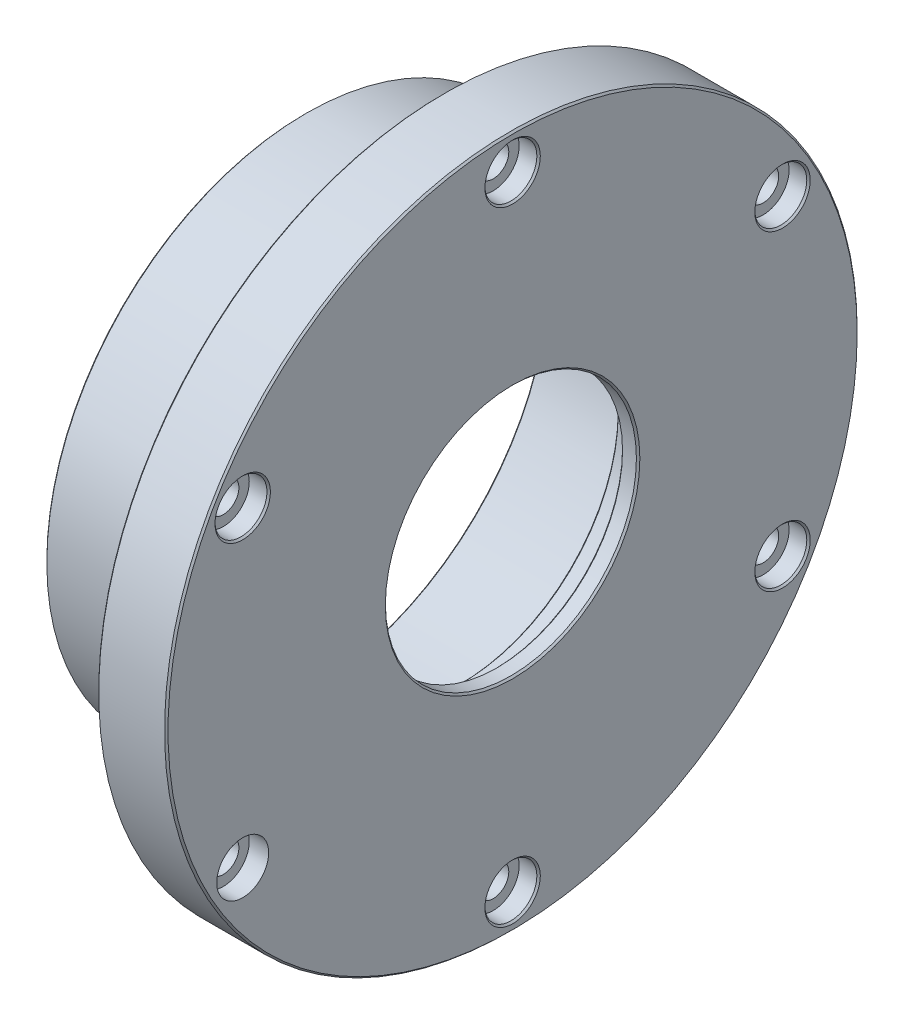
ISO-10303-21;
HEADER;
FILE_DESCRIPTION(('STEP AP214'),'2;1');
FILE_NAME('part.step','',(''),(''),'','','');
FILE_SCHEMA(('AUTOMOTIVE_DESIGN { 1 0 10303 214 1 1 1 1 }'));
ENDSEC;
DATA;
#1=APPLICATION_CONTEXT('core data for automotive mechanical design processes');
#2=APPLICATION_PROTOCOL_DEFINITION('international standard','automotive_design',2000,#1);
#3=PRODUCT_CONTEXT('',#1,'mechanical');
#4=PRODUCT('Part','Part','',(#3));
#5=PRODUCT_RELATED_PRODUCT_CATEGORY('part','',(#4));
#6=PRODUCT_DEFINITION_FORMATION('','',#4);
#7=PRODUCT_DEFINITION_CONTEXT('part definition',#1,'design');
#8=PRODUCT_DEFINITION('design','',#6,#7);
#9=PRODUCT_DEFINITION_SHAPE('','',#8);
#10=(LENGTH_UNIT() NAMED_UNIT(*) SI_UNIT(.MILLI.,.METRE.));
#11=(NAMED_UNIT(*) PLANE_ANGLE_UNIT() SI_UNIT($,.RADIAN.));
#12=(NAMED_UNIT(*) SI_UNIT($,.STERADIAN.) SOLID_ANGLE_UNIT());
#13=UNCERTAINTY_MEASURE_WITH_UNIT(LENGTH_MEASURE(1.E-05),#10,'distance_accuracy_value','');
#14=(GEOMETRIC_REPRESENTATION_CONTEXT(3) GLOBAL_UNCERTAINTY_ASSIGNED_CONTEXT((#13)) GLOBAL_UNIT_ASSIGNED_CONTEXT((#10,
#11,#12)) REPRESENTATION_CONTEXT('',''));
#15=CARTESIAN_POINT('',(0.,0.,0.));
#16=DIRECTION('',(0.,0.,1.));
#17=DIRECTION('',(1.,0.,0.));
#18=AXIS2_PLACEMENT_3D('',#15,#16,#17);
#19=CARTESIAN_POINT('',(22.9387484712198,0.,0.));
#20=DIRECTION('',(1.,0.,0.));
#21=DIRECTION('',(0.,0.,-1.));
#22=AXIS2_PLACEMENT_3D('',#19,#20,#21);
#23=PLANE('',#22);
#24=CARTESIAN_POINT('',(22.9387484712198,-33.1832367172753,0.));
#25=DIRECTION('',(1.,0.,0.));
#26=DIRECTION('',(0.,0.,-1.));
#27=AXIS2_PLACEMENT_3D('',#24,#25,#26);
#28=CIRCLE('',#27,99.5000000000001);
#29=CARTESIAN_POINT('',(22.9387484712198,-33.1832367172753,-99.5000000000001));
#30=VERTEX_POINT('',#29);
#31=EDGE_CURVE('E152',#30,#30,#28,.F.);
#32=ORIENTED_EDGE('',*,*,#31,.T.);
#33=EDGE_LOOP('',(#32));
#34=FACE_BOUND('',#33,.T.);
#35=CARTESIAN_POINT('',(22.9387484712198,-123.183236717275,0.));
#36=DIRECTION('',(1.,0.,0.));
#37=DIRECTION('',(0.,0.,-1.));
#38=AXIS2_PLACEMENT_3D('',#35,#36,#37);
#39=CIRCLE('',#38,5.);
#40=CARTESIAN_POINT('',(22.9387484712198,-123.183236717275,-5.00000000000002));
#41=VERTEX_POINT('',#40);
#42=EDGE_CURVE('E156',#41,#41,#39,.T.);
#43=ORIENTED_EDGE('',*,*,#42,.T.);
#44=EDGE_LOOP('',(#43));
#45=FACE_BOUND('',#44,.T.);
#46=CARTESIAN_POINT('',(22.9387484712198,-78.1832367172752,-77.9422863405995));
#47=DIRECTION('',(1.,0.,0.));
#48=DIRECTION('',(0.,0.,-1.));
#49=AXIS2_PLACEMENT_3D('',#46,#47,#48);
#50=CIRCLE('',#49,5.);
#51=CARTESIAN_POINT('',(22.9387484712198,-78.1832367172752,-82.9422863405995));
#52=VERTEX_POINT('',#51);
#53=EDGE_CURVE('E160',#52,#52,#50,.T.);
#54=ORIENTED_EDGE('',*,*,#53,.T.);
#55=EDGE_LOOP('',(#54));
#56=FACE_BOUND('',#55,.T.);
#57=CARTESIAN_POINT('',(22.9387484712198,11.8167632827247,-77.9422863405995));
#58=DIRECTION('',(1.,0.,0.));
#59=DIRECTION('',(0.,0.,-1.));
#60=AXIS2_PLACEMENT_3D('',#57,#58,#59);
#61=CIRCLE('',#60,5.);
#62=CARTESIAN_POINT('',(22.9387484712198,11.8167632827247,-82.9422863405995));
#63=VERTEX_POINT('',#62);
#64=EDGE_CURVE('E164',#63,#63,#61,.T.);
#65=ORIENTED_EDGE('',*,*,#64,.T.);
#66=EDGE_LOOP('',(#65));
#67=FACE_BOUND('',#66,.T.);
#68=CARTESIAN_POINT('',(22.9387484712198,56.8167632827247,0.));
#69=DIRECTION('',(1.,0.,0.));
#70=DIRECTION('',(0.,0.,-1.));
#71=AXIS2_PLACEMENT_3D('',#68,#69,#70);
#72=CIRCLE('',#71,5.);
#73=CARTESIAN_POINT('',(22.9387484712198,56.8167632827247,-5.));
#74=VERTEX_POINT('',#73);
#75=EDGE_CURVE('E168',#74,#74,#72,.T.);
#76=ORIENTED_EDGE('',*,*,#75,.T.);
#77=EDGE_LOOP('',(#76));
#78=FACE_BOUND('',#77,.T.);
#79=CARTESIAN_POINT('',(22.9387484712198,11.8167632827247,77.9422863405995));
#80=DIRECTION('',(1.,0.,0.));
#81=DIRECTION('',(0.,0.,-1.));
#82=AXIS2_PLACEMENT_3D('',#79,#80,#81);
#83=CIRCLE('',#82,5.);
#84=CARTESIAN_POINT('',(22.9387484712198,11.8167632827247,72.9422863405995));
#85=VERTEX_POINT('',#84);
#86=EDGE_CURVE('E172',#85,#85,#83,.T.);
#87=ORIENTED_EDGE('',*,*,#86,.T.);
#88=EDGE_LOOP('',(#87));
#89=FACE_BOUND('',#88,.T.);
#90=CARTESIAN_POINT('',(22.9387484712198,-78.1832367172753,77.9422863405995));
#91=DIRECTION('',(1.,0.,0.));
#92=DIRECTION('',(0.,0.,-1.));
#93=AXIS2_PLACEMENT_3D('',#90,#91,#92);
#94=CIRCLE('',#93,5.);
#95=CARTESIAN_POINT('',(22.9387484712198,-78.1832367172753,72.9422863405995));
#96=VERTEX_POINT('',#95);
#97=EDGE_CURVE('E176',#96,#96,#94,.T.);
#98=ORIENTED_EDGE('',*,*,#97,.T.);
#99=EDGE_LOOP('',(#98));
#100=FACE_BOUND('',#99,.T.);
#101=CARTESIAN_POINT('',(22.9387484712198,-33.1832367172753,0.));
#102=DIRECTION('',(-1.,0.,0.));
#103=DIRECTION('',(0.,0.,1.));
#104=AXIS2_PLACEMENT_3D('',#101,#102,#103);
#105=CIRCLE('',#104,75.);
#106=CARTESIAN_POINT('',(22.9387484712198,-33.1832367172753,75.));
#107=VERTEX_POINT('',#106);
#108=EDGE_CURVE('E216',#107,#107,#105,.T.);
#109=ORIENTED_EDGE('',*,*,#108,.F.);
#110=EDGE_LOOP('',(#109));
#111=FACE_BOUND('',#110,.T.);
#112=ADVANCED_FACE('F47',(#34,#45,#56,#67,#78,#89,#100,#111),#23,.F.);
#113=CARTESIAN_POINT('',(-15.2619045358166,-33.1832367172753,0.));
#114=DIRECTION('',(-1.,0.,0.));
#115=DIRECTION('',(0.,0.,1.));
#116=AXIS2_PLACEMENT_3D('',#113,#114,#115);
#117=CYLINDRICAL_SURFACE('',#116,60.);
#118=CARTESIAN_POINT('',(22.4387484712199,-33.1832367172753,0.));
#119=DIRECTION('',(-1.,0.,0.));
#120=DIRECTION('',(0.,0.,1.));
#121=AXIS2_PLACEMENT_3D('',#118,#119,#120);
#122=CIRCLE('',#121,60.);
#123=CARTESIAN_POINT('',(22.4387484712199,-33.1832367172753,60.));
#124=VERTEX_POINT('',#123);
#125=EDGE_CURVE('E196',#124,#124,#122,.T.);
#126=ORIENTED_EDGE('',*,*,#125,.T.);
#127=EDGE_LOOP('',(#126));
#128=FACE_BOUND('',#127,.T.);
#129=CARTESIAN_POINT('',(27.9387484712198,-33.1832367172753,0.));
#130=DIRECTION('',(-1.,0.,0.));
#131=DIRECTION('',(0.,0.,1.));
#132=AXIS2_PLACEMENT_3D('',#129,#130,#131);
#133=CIRCLE('',#132,60.);
#134=CARTESIAN_POINT('',(27.9387484712198,-33.1832367172753,60.));
#135=VERTEX_POINT('',#134);
#136=EDGE_CURVE('E208',#135,#135,#133,.T.);
#137=ORIENTED_EDGE('',*,*,#136,.F.);
#138=EDGE_LOOP('',(#137));
#139=FACE_BOUND('',#138,.T.);
#140=ADVANCED_FACE('F296',(#128,#139),#117,.F.);
#141=CARTESIAN_POINT('',(27.9387484712198,0.,0.));
#142=DIRECTION('',(1.,0.,0.));
#143=DIRECTION('',(0.,0.,-1.));
#144=AXIS2_PLACEMENT_3D('',#141,#142,#143);
#145=PLANE('',#144);
#146=CARTESIAN_POINT('',(27.9387484712198,-33.1832367172753,0.));
#147=DIRECTION('',(1.,0.,0.));
#148=DIRECTION('',(0.,0.,-1.));
#149=AXIS2_PLACEMENT_3D('',#146,#147,#148);
#150=CIRCLE('',#149,45.5);
#151=CARTESIAN_POINT('',(27.9387484712198,-33.1832367172753,-45.5));
#152=VERTEX_POINT('',#151);
#153=EDGE_CURVE('E200',#152,#152,#150,.T.);
#154=ORIENTED_EDGE('',*,*,#153,.T.);
#155=EDGE_LOOP('',(#154));
#156=FACE_BOUND('',#155,.T.);
#157=ORIENTED_EDGE('',*,*,#136,.T.);
#158=EDGE_LOOP('',(#157));
#159=FACE_BOUND('',#158,.T.);
#160=ADVANCED_FACE('F302',(#156,#159),#145,.F.);
#161=CARTESIAN_POINT('',(-15.2619045358166,-33.1832367172753,0.));
#162=DIRECTION('',(-1.,0.,0.));
#163=DIRECTION('',(0.,0.,1.));
#164=AXIS2_PLACEMENT_3D('',#161,#162,#163);
#165=CYLINDRICAL_SURFACE('',#164,45.);
#166=CARTESIAN_POINT('',(28.4387484712198,-33.1832367172753,0.));
#167=DIRECTION('',(1.,0.,0.));
#168=DIRECTION('',(0.,0.,-1.));
#169=AXIS2_PLACEMENT_3D('',#166,#167,#168);
#170=CIRCLE('',#169,45.);
#171=CARTESIAN_POINT('',(28.4387484712198,-33.1832367172753,-45.));
#172=VERTEX_POINT('',#171);
#173=EDGE_CURVE('E204',#172,#172,#170,.F.);
#174=ORIENTED_EDGE('',*,*,#173,.T.);
#175=EDGE_LOOP('',(#174));
#176=FACE_BOUND('',#175,.T.);
#177=CARTESIAN_POINT('',(37.9387484712198,-33.1832367172753,0.));
#178=DIRECTION('',(-1.,0.,0.));
#179=DIRECTION('',(0.,0.,1.));
#180=AXIS2_PLACEMENT_3D('',#177,#178,#179);
#181=CIRCLE('',#180,45.);
#182=CARTESIAN_POINT('',(37.9387484712198,-33.1832367172753,45.));
#183=VERTEX_POINT('',#182);
#184=EDGE_CURVE('E212',#183,#183,#181,.T.);
#185=ORIENTED_EDGE('',*,*,#184,.F.);
#186=EDGE_LOOP('',(#185));
#187=FACE_BOUND('',#186,.T.);
#188=ADVANCED_FACE('F325',(#176,#187),#165,.F.);
#189=CARTESIAN_POINT('',(37.9387484712198,0.,0.));
#190=DIRECTION('',(1.,0.,0.));
#191=DIRECTION('',(0.,0.,-1.));
#192=AXIS2_PLACEMENT_3D('',#189,#190,#191);
#193=PLANE('',#192);
#194=CARTESIAN_POINT('',(37.9387484712198,-33.1832367172753,0.));
#195=DIRECTION('',(1.,0.,0.));
#196=DIRECTION('',(0.,0.,-1.));
#197=AXIS2_PLACEMENT_3D('',#194,#195,#196);
#198=CIRCLE('',#197,36.75);
#199=CARTESIAN_POINT('',(37.9387484712198,-33.1832367172753,-36.75));
#200=VERTEX_POINT('',#199);
#201=EDGE_CURVE('E180',#200,#200,#198,.T.);
#202=ORIENTED_EDGE('',*,*,#201,.T.);
#203=EDGE_LOOP('',(#202));
#204=FACE_BOUND('',#203,.T.);
#205=ORIENTED_EDGE('',*,*,#184,.T.);
#206=EDGE_LOOP('',(#205));
#207=FACE_BOUND('',#206,.T.);
#208=ADVANCED_FACE('F321',(#204,#207),#193,.F.);
#209=CARTESIAN_POINT('',(-15.2619045358166,-33.1832367172753,0.));
#210=DIRECTION('',(-1.,0.,0.));
#211=DIRECTION('',(0.,0.,1.));
#212=AXIS2_PLACEMENT_3D('',#209,#210,#211);
#213=CYLINDRICAL_SURFACE('',#212,36.25);
#214=CARTESIAN_POINT('',(38.4387484712198,-33.1832367172753,0.));
#215=DIRECTION('',(1.,0.,0.));
#216=DIRECTION('',(0.,0.,-1.));
#217=AXIS2_PLACEMENT_3D('',#214,#215,#216);
#218=CIRCLE('',#217,36.25);
#219=CARTESIAN_POINT('',(38.4387484712198,-33.1832367172753,-36.25));
#220=VERTEX_POINT('',#219);
#221=EDGE_CURVE('E184',#220,#220,#218,.F.);
#222=ORIENTED_EDGE('',*,*,#221,.T.);
#223=EDGE_LOOP('',(#222));
#224=FACE_BOUND('',#223,.T.);
#225=CARTESIAN_POINT('',(42.4387484712199,-33.1832367172753,0.));
#226=DIRECTION('',(1.,0.,0.));
#227=DIRECTION('',(0.,0.,-1.));
#228=AXIS2_PLACEMENT_3D('',#225,#226,#227);
#229=CIRCLE('',#228,36.25);
#230=CARTESIAN_POINT('',(42.4387484712199,-33.1832367172753,-36.25));
#231=VERTEX_POINT('',#230);
#232=EDGE_CURVE('E188',#231,#231,#229,.T.);
#233=ORIENTED_EDGE('',*,*,#232,.T.);
#234=EDGE_LOOP('',(#233));
#235=FACE_BOUND('',#234,.T.);
#236=ADVANCED_FACE('F317',(#224,#235),#213,.F.);
#237=CARTESIAN_POINT('',(42.9387484712198,0.,0.));
#238=DIRECTION('',(1.,0.,0.));
#239=DIRECTION('',(0.,0.,-1.));
#240=AXIS2_PLACEMENT_3D('',#237,#238,#239);
#241=PLANE('',#240);
#242=CARTESIAN_POINT('',(42.9387484712198,-123.183236717275,0.));
#243=DIRECTION('',(1.,0.,0.));
#244=DIRECTION('',(0.,0.,-1.));
#245=AXIS2_PLACEMENT_3D('',#242,#243,#244);
#246=CIRCLE('',#245,7.99999999999992);
#247=CARTESIAN_POINT('',(42.9387484712198,-123.183236717275,-7.99999999999993));
#248=VERTEX_POINT('',#247);
#249=EDGE_CURVE('E76',#248,#248,#246,.F.);
#250=ORIENTED_EDGE('',*,*,#249,.T.);
#251=EDGE_LOOP('',(#250));
#252=FACE_BOUND('',#251,.T.);
#253=CARTESIAN_POINT('',(42.9387484712198,-78.1832367172752,-77.9422863405995));
#254=DIRECTION('',(1.,0.,0.));
#255=DIRECTION('',(0.,0.,-1.));
#256=AXIS2_PLACEMENT_3D('',#253,#254,#255);
#257=CIRCLE('',#256,7.99999999999992);
#258=CARTESIAN_POINT('',(42.9387484712198,-78.1832367172752,-85.9422863405994));
#259=VERTEX_POINT('',#258);
#260=EDGE_CURVE('E80',#259,#259,#257,.F.);
#261=ORIENTED_EDGE('',*,*,#260,.T.);
#262=EDGE_LOOP('',(#261));
#263=FACE_BOUND('',#262,.T.);
#264=CARTESIAN_POINT('',(42.9387484712198,11.8167632827247,-77.9422863405995));
#265=DIRECTION('',(1.,0.,0.));
#266=DIRECTION('',(0.,0.,-1.));
#267=AXIS2_PLACEMENT_3D('',#264,#265,#266);
#268=CIRCLE('',#267,7.99999999999992);
#269=CARTESIAN_POINT('',(42.9387484712198,11.8167632827247,-85.9422863405994));
#270=VERTEX_POINT('',#269);
#271=EDGE_CURVE('E84',#270,#270,#268,.F.);
#272=ORIENTED_EDGE('',*,*,#271,.T.);
#273=EDGE_LOOP('',(#272));
#274=FACE_BOUND('',#273,.T.);
#275=CARTESIAN_POINT('',(42.9387484712198,56.8167632827247,0.));
#276=DIRECTION('',(1.,0.,0.));
#277=DIRECTION('',(0.,0.,-1.));
#278=AXIS2_PLACEMENT_3D('',#275,#276,#277);
#279=CIRCLE('',#278,7.99999999999992);
#280=CARTESIAN_POINT('',(42.9387484712198,56.8167632827247,-7.99999999999992));
#281=VERTEX_POINT('',#280);
#282=EDGE_CURVE('E88',#281,#281,#279,.F.);
#283=ORIENTED_EDGE('',*,*,#282,.T.);
#284=EDGE_LOOP('',(#283));
#285=FACE_BOUND('',#284,.T.);
#286=CARTESIAN_POINT('',(42.9387484712198,11.8167632827247,77.9422863405995));
#287=DIRECTION('',(1.,0.,0.));
#288=DIRECTION('',(0.,0.,-1.));
#289=AXIS2_PLACEMENT_3D('',#286,#287,#288);
#290=CIRCLE('',#289,7.99999999999992);
#291=CARTESIAN_POINT('',(42.9387484712198,11.8167632827247,69.9422863405996));
#292=VERTEX_POINT('',#291);
#293=EDGE_CURVE('E92',#292,#292,#290,.F.);
#294=ORIENTED_EDGE('',*,*,#293,.T.);
#295=EDGE_LOOP('',(#294));
#296=FACE_BOUND('',#295,.T.);
#297=CARTESIAN_POINT('',(42.9387484712198,-33.1832367172753,0.));
#298=DIRECTION('',(1.,0.,0.));
#299=DIRECTION('',(0.,0.,-1.));
#300=AXIS2_PLACEMENT_3D('',#297,#298,#299);
#301=CIRCLE('',#300,36.7499999999999);
#302=CARTESIAN_POINT('',(42.9387484712198,-33.1832367172753,-36.7499999999999));
#303=VERTEX_POINT('',#302);
#304=EDGE_CURVE('E96',#303,#303,#301,.F.);
#305=ORIENTED_EDGE('',*,*,#304,.T.);
#306=EDGE_LOOP('',(#305));
#307=FACE_BOUND('',#306,.T.);
#308=CARTESIAN_POINT('',(42.9387484712198,-33.1832367172753,0.));
#309=DIRECTION('',(1.,0.,0.));
#310=DIRECTION('',(0.,0.,-1.));
#311=AXIS2_PLACEMENT_3D('',#308,#309,#310);
#312=CIRCLE('',#311,99.5);
#313=CARTESIAN_POINT('',(42.9387484712198,-33.1832367172753,-99.5));
#314=VERTEX_POINT('',#313);
#315=EDGE_CURVE('E100',#314,#314,#312,.T.);
#316=ORIENTED_EDGE('',*,*,#315,.T.);
#317=EDGE_LOOP('',(#316));
#318=FACE_BOUND('',#317,.T.);
#319=CARTESIAN_POINT('',(42.9387484712198,-78.1832367172753,77.9422863405995));
#320=DIRECTION('',(1.,0.,0.));
#321=DIRECTION('',(0.,0.,-1.));
#322=AXIS2_PLACEMENT_3D('',#319,#320,#321);
#323=CIRCLE('',#322,7.50000000000001);
#324=CARTESIAN_POINT('',(42.9387484712198,-78.1832367172753,70.4422863405995));
#325=VERTEX_POINT('',#324);
#326=EDGE_CURVE('E256',#325,#325,#323,.T.);
#327=ORIENTED_EDGE('',*,*,#326,.F.);
#328=EDGE_LOOP('',(#327));
#329=FACE_BOUND('',#328,.T.);
#330=ADVANCED_FACE('F313',(#252,#263,#274,#285,#296,#307,#318,#329),#241,.T.);
#331=CARTESIAN_POINT('',(-15.2619045358166,-33.1832367172753,0.));
#332=DIRECTION('',(-1.,0.,0.));
#333=DIRECTION('',(0.,0.,1.));
#334=AXIS2_PLACEMENT_3D('',#331,#332,#333);
#335=CYLINDRICAL_SURFACE('',#334,100.);
#336=CARTESIAN_POINT('',(23.4387484712198,-33.1832367172753,0.));
#337=DIRECTION('',(1.,0.,0.));
#338=DIRECTION('',(0.,0.,-1.));
#339=AXIS2_PLACEMENT_3D('',#336,#337,#338);
#340=CIRCLE('',#339,100.);
#341=CARTESIAN_POINT('',(23.4387484712198,-33.1832367172753,-100.));
#342=VERTEX_POINT('',#341);
#343=EDGE_CURVE('E144',#342,#342,#340,.T.);
#344=ORIENTED_EDGE('',*,*,#343,.T.);
#345=EDGE_LOOP('',(#344));
#346=FACE_BOUND('',#345,.T.);
#347=CARTESIAN_POINT('',(42.4387484712198,-33.1832367172753,0.));
#348=DIRECTION('',(1.,0.,0.));
#349=DIRECTION('',(0.,0.,-1.));
#350=AXIS2_PLACEMENT_3D('',#347,#348,#349);
#351=CIRCLE('',#350,100.);
#352=CARTESIAN_POINT('',(42.4387484712198,-33.1832367172753,-100.));
#353=VERTEX_POINT('',#352);
#354=EDGE_CURVE('E148',#353,#353,#351,.F.);
#355=ORIENTED_EDGE('',*,*,#354,.T.);
#356=EDGE_LOOP('',(#355));
#357=FACE_BOUND('',#356,.T.);
#358=ADVANCED_FACE('F310',(#346,#357),#335,.T.);
#359=CARTESIAN_POINT('',(-15.2619045358166,-33.1832367172753,0.));
#360=DIRECTION('',(-1.,0.,0.));
#361=DIRECTION('',(0.,0.,1.));
#362=AXIS2_PLACEMENT_3D('',#359,#360,#361);
#363=CYLINDRICAL_SURFACE('',#362,75.);
#364=CARTESIAN_POINT('',(-16.5612515287802,-33.1832367172753,0.));
#365=DIRECTION('',(1.,0.,0.));
#366=DIRECTION('',(0.,0.,-1.));
#367=AXIS2_PLACEMENT_3D('',#364,#365,#366);
#368=CIRCLE('',#367,75.);
#369=CARTESIAN_POINT('',(-16.5612515287802,-33.1832367172753,-75.));
#370=VERTEX_POINT('',#369);
#371=EDGE_CURVE('E132',#370,#370,#368,.T.);
#372=ORIENTED_EDGE('',*,*,#371,.T.);
#373=EDGE_LOOP('',(#372));
#374=FACE_BOUND('',#373,.T.);
#375=ORIENTED_EDGE('',*,*,#108,.T.);
#376=EDGE_LOOP('',(#375));
#377=FACE_BOUND('',#376,.T.);
#378=ADVANCED_FACE('F308',(#374,#377),#363,.T.);
#379=CARTESIAN_POINT('',(-17.0612515287802,0.,0.));
#380=DIRECTION('',(1.,0.,0.));
#381=DIRECTION('',(0.,0.,-1.));
#382=AXIS2_PLACEMENT_3D('',#379,#380,#381);
#383=PLANE('',#382);
#384=CARTESIAN_POINT('',(-17.0612515287802,-33.1832367172753,0.));
#385=DIRECTION('',(1.,0.,0.));
#386=DIRECTION('',(0.,0.,-1.));
#387=AXIS2_PLACEMENT_3D('',#384,#385,#386);
#388=CIRCLE('',#387,74.5);
#389=CARTESIAN_POINT('',(-17.0612515287802,-33.1832367172753,-74.5));
#390=VERTEX_POINT('',#389);
#391=EDGE_CURVE('E136',#390,#390,#388,.F.);
#392=ORIENTED_EDGE('',*,*,#391,.T.);
#393=EDGE_LOOP('',(#392));
#394=FACE_BOUND('',#393,.T.);
#395=CARTESIAN_POINT('',(-17.0612515287802,-33.1832367172753,0.));
#396=DIRECTION('',(1.,0.,0.));
#397=DIRECTION('',(0.,0.,-1.));
#398=AXIS2_PLACEMENT_3D('',#395,#396,#397);
#399=CIRCLE('',#398,70.5);
#400=CARTESIAN_POINT('',(-17.0612515287802,-33.1832367172753,-70.5));
#401=VERTEX_POINT('',#400);
#402=EDGE_CURVE('E140',#401,#401,#399,.T.);
#403=ORIENTED_EDGE('',*,*,#402,.T.);
#404=EDGE_LOOP('',(#403));
#405=FACE_BOUND('',#404,.T.);
#406=ADVANCED_FACE('F530',(#394,#405),#383,.F.);
#407=CARTESIAN_POINT('',(-15.2619045358166,-33.1832367172753,0.));
#408=DIRECTION('',(-1.,0.,0.));
#409=DIRECTION('',(0.,0.,1.));
#410=AXIS2_PLACEMENT_3D('',#407,#408,#409);
#411=CYLINDRICAL_SURFACE('',#410,70.);
#412=CARTESIAN_POINT('',(-16.5612515287802,-33.1832367172753,0.));
#413=DIRECTION('',(1.,0.,0.));
#414=DIRECTION('',(0.,0.,-1.));
#415=AXIS2_PLACEMENT_3D('',#412,#413,#414);
#416=CIRCLE('',#415,70.);
#417=CARTESIAN_POINT('',(-16.5612515287802,-33.1832367172753,-70.));
#418=VERTEX_POINT('',#417);
#419=EDGE_CURVE('E10',#418,#418,#416,.F.);
#420=ORIENTED_EDGE('',*,*,#419,.T.);
#421=EDGE_LOOP('',(#420));
#422=FACE_BOUND('',#421,.T.);
#423=CARTESIAN_POINT('',(21.9387484712198,-33.1832367172753,0.));
#424=DIRECTION('',(-1.,0.,0.));
#425=DIRECTION('',(0.,0.,1.));
#426=AXIS2_PLACEMENT_3D('',#423,#424,#425);
#427=CIRCLE('',#426,70.);
#428=CARTESIAN_POINT('',(21.9387484712198,-33.1832367172753,70.));
#429=VERTEX_POINT('',#428);
#430=EDGE_CURVE('E220',#429,#429,#427,.T.);
#431=ORIENTED_EDGE('',*,*,#430,.F.);
#432=EDGE_LOOP('',(#431));
#433=FACE_BOUND('',#432,.T.);
#434=ADVANCED_FACE('F527',(#422,#433),#411,.F.);
#435=CARTESIAN_POINT('',(21.9387484712198,0.,0.));
#436=DIRECTION('',(-1.,0.,0.));
#437=DIRECTION('',(0.,0.,1.));
#438=AXIS2_PLACEMENT_3D('',#435,#436,#437);
#439=PLANE('',#438);
#440=CARTESIAN_POINT('',(21.9387484712198,-33.1832367172753,0.));
#441=DIRECTION('',(-1.,0.,0.));
#442=DIRECTION('',(0.,0.,1.));
#443=AXIS2_PLACEMENT_3D('',#440,#441,#442);
#444=CIRCLE('',#443,60.5000000000001);
#445=CARTESIAN_POINT('',(21.9387484712198,-33.1832367172753,60.5000000000001));
#446=VERTEX_POINT('',#445);
#447=EDGE_CURVE('E192',#446,#446,#444,.F.);
#448=ORIENTED_EDGE('',*,*,#447,.T.);
#449=EDGE_LOOP('',(#448));
#450=FACE_BOUND('',#449,.T.);
#451=ORIENTED_EDGE('',*,*,#430,.T.);
#452=EDGE_LOOP('',(#451));
#453=FACE_BOUND('',#452,.T.);
#454=ADVANCED_FACE('F523',(#450,#453),#439,.T.);
#455=CARTESIAN_POINT('',(42.9387484712198,11.8167632827247,-77.9422863405995));
#456=DIRECTION('',(1.,0.,0.));
#457=DIRECTION('',(0.,0.,-1.));
#458=AXIS2_PLACEMENT_3D('',#455,#456,#457);
#459=CYLINDRICAL_SURFACE('',#458,4.5);
#460=CARTESIAN_POINT('',(23.4387484712198,11.8167632827247,-77.9422863405995));
#461=DIRECTION('',(1.,0.,0.));
#462=DIRECTION('',(0.,0.,-1.));
#463=AXIS2_PLACEMENT_3D('',#460,#461,#462);
#464=CIRCLE('',#463,4.5);
#465=CARTESIAN_POINT('',(23.4387484712198,11.8167632827247,-82.4422863405995));
#466=VERTEX_POINT('',#465);
#467=EDGE_CURVE('E120',#466,#466,#464,.F.);
#468=ORIENTED_EDGE('',*,*,#467,.T.);
#469=EDGE_LOOP('',(#468));
#470=FACE_BOUND('',#469,.T.);
#471=CARTESIAN_POINT('',(37.3387484712198,11.8167632827247,-77.9422863405995));
#472=DIRECTION('',(1.,0.,0.));
#473=DIRECTION('',(0.,0.,-1.));
#474=AXIS2_PLACEMENT_3D('',#471,#472,#473);
#475=CIRCLE('',#474,4.5);
#476=CARTESIAN_POINT('',(37.3387484712198,11.8167632827247,-82.4422863405995));
#477=VERTEX_POINT('',#476);
#478=EDGE_CURVE('E224',#477,#477,#475,.T.);
#479=ORIENTED_EDGE('',*,*,#478,.T.);
#480=EDGE_LOOP('',(#479));
#481=FACE_BOUND('',#480,.T.);
#482=ADVANCED_FACE('F519',(#470,#481),#459,.F.);
#483=CARTESIAN_POINT('',(37.3387484712198,16.3167632827247,-77.9422863405995));
#484=DIRECTION('',(-1.,0.,0.));
#485=DIRECTION('',(0.,0.,1.));
#486=AXIS2_PLACEMENT_3D('',#483,#484,#485);
#487=PLANE('',#486);
#488=ORIENTED_EDGE('',*,*,#478,.F.);
#489=EDGE_LOOP('',(#488));
#490=FACE_BOUND('',#489,.T.);
#491=CARTESIAN_POINT('',(37.3387484712198,11.8167632827247,-77.9422863405995));
#492=DIRECTION('',(1.,0.,0.));
#493=DIRECTION('',(0.,0.,-1.));
#494=AXIS2_PLACEMENT_3D('',#491,#492,#493);
#495=CIRCLE('',#494,7.5);
#496=CARTESIAN_POINT('',(37.3387484712198,11.8167632827247,-85.4422863405995));
#497=VERTEX_POINT('',#496);
#498=EDGE_CURVE('E228',#497,#497,#495,.T.);
#499=ORIENTED_EDGE('',*,*,#498,.T.);
#500=EDGE_LOOP('',(#499));
#501=FACE_BOUND('',#500,.T.);
#502=ADVANCED_FACE('F515',(#490,#501),#487,.F.);
#503=CARTESIAN_POINT('',(42.9387484712198,11.8167632827247,-77.9422863405995));
#504=DIRECTION('',(1.,0.,0.));
#505=DIRECTION('',(0.,0.,-1.));
#506=AXIS2_PLACEMENT_3D('',#503,#504,#505);
#507=CYLINDRICAL_SURFACE('',#506,7.5);
#508=CARTESIAN_POINT('',(42.4387484712199,11.8167632827247,-77.9422863405995));
#509=DIRECTION('',(1.,0.,0.));
#510=DIRECTION('',(0.,0.,-1.));
#511=AXIS2_PLACEMENT_3D('',#508,#509,#510);
#512=CIRCLE('',#511,7.5);
#513=CARTESIAN_POINT('',(42.4387484712199,11.8167632827247,-85.4422863405995));
#514=VERTEX_POINT('',#513);
#515=EDGE_CURVE('E66',#514,#514,#512,.T.);
#516=ORIENTED_EDGE('',*,*,#515,.T.);
#517=EDGE_LOOP('',(#516));
#518=FACE_BOUND('',#517,.T.);
#519=ORIENTED_EDGE('',*,*,#498,.F.);
#520=EDGE_LOOP('',(#519));
#521=FACE_BOUND('',#520,.T.);
#522=ADVANCED_FACE('F511',(#518,#521),#507,.F.);
#523=CARTESIAN_POINT('',(42.9387484712198,-78.1832367172752,-77.9422863405995));
#524=DIRECTION('',(1.,0.,0.));
#525=DIRECTION('',(0.,0.,-1.));
#526=AXIS2_PLACEMENT_3D('',#523,#524,#525);
#527=CYLINDRICAL_SURFACE('',#526,4.5);
#528=CARTESIAN_POINT('',(23.4387484712198,-78.1832367172752,-77.9422863405995));
#529=DIRECTION('',(1.,0.,0.));
#530=DIRECTION('',(0.,0.,-1.));
#531=AXIS2_PLACEMENT_3D('',#528,#529,#530);
#532=CIRCLE('',#531,4.5);
#533=CARTESIAN_POINT('',(23.4387484712198,-78.1832367172752,-82.4422863405995));
#534=VERTEX_POINT('',#533);
#535=EDGE_CURVE('E124',#534,#534,#532,.F.);
#536=ORIENTED_EDGE('',*,*,#535,.T.);
#537=EDGE_LOOP('',(#536));
#538=FACE_BOUND('',#537,.T.);
#539=CARTESIAN_POINT('',(37.3387484712198,-78.1832367172752,-77.9422863405995));
#540=DIRECTION('',(1.,0.,0.));
#541=DIRECTION('',(0.,0.,-1.));
#542=AXIS2_PLACEMENT_3D('',#539,#540,#541);
#543=CIRCLE('',#542,4.5);
#544=CARTESIAN_POINT('',(37.3387484712198,-78.1832367172752,-82.4422863405995));
#545=VERTEX_POINT('',#544);
#546=EDGE_CURVE('E232',#545,#545,#543,.T.);
#547=ORIENTED_EDGE('',*,*,#546,.T.);
#548=EDGE_LOOP('',(#547));
#549=FACE_BOUND('',#548,.T.);
#550=ADVANCED_FACE('F507',(#538,#549),#527,.F.);
#551=CARTESIAN_POINT('',(37.3387484712198,-73.6832367172752,-77.9422863405995));
#552=DIRECTION('',(-1.,0.,0.));
#553=DIRECTION('',(0.,0.,1.));
#554=AXIS2_PLACEMENT_3D('',#551,#552,#553);
#555=PLANE('',#554);
#556=ORIENTED_EDGE('',*,*,#546,.F.);
#557=EDGE_LOOP('',(#556));
#558=FACE_BOUND('',#557,.T.);
#559=CARTESIAN_POINT('',(37.3387484712198,-78.1832367172752,-77.9422863405995));
#560=DIRECTION('',(1.,0.,0.));
#561=DIRECTION('',(0.,0.,-1.));
#562=AXIS2_PLACEMENT_3D('',#559,#560,#561);
#563=CIRCLE('',#562,7.49999999999999);
#564=CARTESIAN_POINT('',(37.3387484712198,-78.1832367172752,-85.4422863405995));
#565=VERTEX_POINT('',#564);
#566=EDGE_CURVE('E236',#565,#565,#563,.T.);
#567=ORIENTED_EDGE('',*,*,#566,.T.);
#568=EDGE_LOOP('',(#567));
#569=FACE_BOUND('',#568,.T.);
#570=ADVANCED_FACE('F503',(#558,#569),#555,.F.);
#571=CARTESIAN_POINT('',(42.9387484712198,-78.1832367172752,-77.9422863405995));
#572=DIRECTION('',(1.,0.,0.));
#573=DIRECTION('',(0.,0.,-1.));
#574=AXIS2_PLACEMENT_3D('',#571,#572,#573);
#575=CYLINDRICAL_SURFACE('',#574,7.5);
#576=CARTESIAN_POINT('',(42.4387484712199,-78.1832367172752,-77.9422863405995));
#577=DIRECTION('',(1.,0.,0.));
#578=DIRECTION('',(0.,0.,-1.));
#579=AXIS2_PLACEMENT_3D('',#576,#577,#578);
#580=CIRCLE('',#579,7.5);
#581=CARTESIAN_POINT('',(42.4387484712199,-78.1832367172752,-85.4422863405995));
#582=VERTEX_POINT('',#581);
#583=EDGE_CURVE('E72',#582,#582,#580,.T.);
#584=ORIENTED_EDGE('',*,*,#583,.T.);
#585=EDGE_LOOP('',(#584));
#586=FACE_BOUND('',#585,.T.);
#587=ORIENTED_EDGE('',*,*,#566,.F.);
#588=EDGE_LOOP('',(#587));
#589=FACE_BOUND('',#588,.T.);
#590=ADVANCED_FACE('F499',(#586,#589),#575,.F.);
#591=CARTESIAN_POINT('',(42.9387484712198,-123.183236717275,0.));
#592=DIRECTION('',(1.,0.,0.));
#593=DIRECTION('',(0.,0.,-1.));
#594=AXIS2_PLACEMENT_3D('',#591,#592,#593);
#595=CYLINDRICAL_SURFACE('',#594,4.5);
#596=CARTESIAN_POINT('',(23.4387484712198,-123.183236717275,0.));
#597=DIRECTION('',(1.,0.,0.));
#598=DIRECTION('',(0.,0.,-1.));
#599=AXIS2_PLACEMENT_3D('',#596,#597,#598);
#600=CIRCLE('',#599,4.5);
#601=CARTESIAN_POINT('',(23.4387484712198,-123.183236717275,-4.50000000000001));
#602=VERTEX_POINT('',#601);
#603=EDGE_CURVE('E128',#602,#602,#600,.F.);
#604=ORIENTED_EDGE('',*,*,#603,.T.);
#605=EDGE_LOOP('',(#604));
#606=FACE_BOUND('',#605,.T.);
#607=CARTESIAN_POINT('',(37.3387484712198,-123.183236717275,0.));
#608=DIRECTION('',(1.,0.,0.));
#609=DIRECTION('',(0.,0.,-1.));
#610=AXIS2_PLACEMENT_3D('',#607,#608,#609);
#611=CIRCLE('',#610,4.5);
#612=CARTESIAN_POINT('',(37.3387484712198,-123.183236717275,-4.50000000000002));
#613=VERTEX_POINT('',#612);
#614=EDGE_CURVE('E240',#613,#613,#611,.T.);
#615=ORIENTED_EDGE('',*,*,#614,.T.);
#616=EDGE_LOOP('',(#615));
#617=FACE_BOUND('',#616,.T.);
#618=ADVANCED_FACE('F495',(#606,#617),#595,.F.);
#619=CARTESIAN_POINT('',(37.3387484712198,-118.683236717275,0.));
#620=DIRECTION('',(-1.,0.,0.));
#621=DIRECTION('',(0.,0.,1.));
#622=AXIS2_PLACEMENT_3D('',#619,#620,#621);
#623=PLANE('',#622);
#624=ORIENTED_EDGE('',*,*,#614,.F.);
#625=EDGE_LOOP('',(#624));
#626=FACE_BOUND('',#625,.T.);
#627=CARTESIAN_POINT('',(37.3387484712198,-123.183236717275,0.));
#628=DIRECTION('',(1.,0.,0.));
#629=DIRECTION('',(0.,0.,-1.));
#630=AXIS2_PLACEMENT_3D('',#627,#628,#629);
#631=CIRCLE('',#630,7.49999999999999);
#632=CARTESIAN_POINT('',(37.3387484712198,-123.183236717275,-7.5));
#633=VERTEX_POINT('',#632);
#634=EDGE_CURVE('E244',#633,#633,#631,.T.);
#635=ORIENTED_EDGE('',*,*,#634,.T.);
#636=EDGE_LOOP('',(#635));
#637=FACE_BOUND('',#636,.T.);
#638=ADVANCED_FACE('F491',(#626,#637),#623,.F.);
#639=CARTESIAN_POINT('',(42.9387484712198,-123.183236717275,0.));
#640=DIRECTION('',(1.,0.,0.));
#641=DIRECTION('',(0.,0.,-1.));
#642=AXIS2_PLACEMENT_3D('',#639,#640,#641);
#643=CYLINDRICAL_SURFACE('',#642,7.5);
#644=CARTESIAN_POINT('',(42.4387484712199,-123.183236717275,0.));
#645=DIRECTION('',(1.,0.,0.));
#646=DIRECTION('',(0.,0.,-1.));
#647=AXIS2_PLACEMENT_3D('',#644,#645,#646);
#648=CIRCLE('',#647,7.5);
#649=CARTESIAN_POINT('',(42.4387484712199,-123.183236717275,-7.50000000000001));
#650=VERTEX_POINT('',#649);
#651=EDGE_CURVE('E104',#650,#650,#648,.T.);
#652=ORIENTED_EDGE('',*,*,#651,.T.);
#653=EDGE_LOOP('',(#652));
#654=FACE_BOUND('',#653,.T.);
#655=ORIENTED_EDGE('',*,*,#634,.F.);
#656=EDGE_LOOP('',(#655));
#657=FACE_BOUND('',#656,.T.);
#658=ADVANCED_FACE('F487',(#654,#657),#643,.F.);
#659=CARTESIAN_POINT('',(42.9387484712198,-78.1832367172753,77.9422863405995));
#660=DIRECTION('',(1.,0.,0.));
#661=DIRECTION('',(0.,0.,-1.));
#662=AXIS2_PLACEMENT_3D('',#659,#660,#661);
#663=CYLINDRICAL_SURFACE('',#662,4.5);
#664=CARTESIAN_POINT('',(23.4387484712198,-78.1832367172753,77.9422863405995));
#665=DIRECTION('',(1.,0.,0.));
#666=DIRECTION('',(0.,0.,-1.));
#667=AXIS2_PLACEMENT_3D('',#664,#665,#666);
#668=CIRCLE('',#667,4.5);
#669=CARTESIAN_POINT('',(23.4387484712198,-78.1832367172753,73.4422863405995));
#670=VERTEX_POINT('',#669);
#671=EDGE_CURVE('E108',#670,#670,#668,.F.);
#672=ORIENTED_EDGE('',*,*,#671,.T.);
#673=EDGE_LOOP('',(#672));
#674=FACE_BOUND('',#673,.T.);
#675=CARTESIAN_POINT('',(37.3387484712198,-78.1832367172753,77.9422863405995));
#676=DIRECTION('',(1.,0.,0.));
#677=DIRECTION('',(0.,0.,-1.));
#678=AXIS2_PLACEMENT_3D('',#675,#676,#677);
#679=CIRCLE('',#678,4.5);
#680=CARTESIAN_POINT('',(37.3387484712198,-78.1832367172753,73.4422863405995));
#681=VERTEX_POINT('',#680);
#682=EDGE_CURVE('E248',#681,#681,#679,.T.);
#683=ORIENTED_EDGE('',*,*,#682,.T.);
#684=EDGE_LOOP('',(#683));
#685=FACE_BOUND('',#684,.T.);
#686=ADVANCED_FACE('F479',(#674,#685),#663,.F.);
#687=CARTESIAN_POINT('',(37.3387484712198,-73.6832367172753,77.9422863405995));
#688=DIRECTION('',(-1.,0.,0.));
#689=DIRECTION('',(0.,0.,1.));
#690=AXIS2_PLACEMENT_3D('',#687,#688,#689);
#691=PLANE('',#690);
#692=ORIENTED_EDGE('',*,*,#682,.F.);
#693=EDGE_LOOP('',(#692));
#694=FACE_BOUND('',#693,.T.);
#695=CARTESIAN_POINT('',(37.3387484712198,-78.1832367172753,77.9422863405995));
#696=DIRECTION('',(1.,0.,0.));
#697=DIRECTION('',(0.,0.,-1.));
#698=AXIS2_PLACEMENT_3D('',#695,#696,#697);
#699=CIRCLE('',#698,7.49999999999999);
#700=CARTESIAN_POINT('',(37.3387484712198,-78.1832367172753,70.4422863405995));
#701=VERTEX_POINT('',#700);
#702=EDGE_CURVE('E252',#701,#701,#699,.T.);
#703=ORIENTED_EDGE('',*,*,#702,.T.);
#704=EDGE_LOOP('',(#703));
#705=FACE_BOUND('',#704,.T.);
#706=ADVANCED_FACE('F468',(#694,#705),#691,.F.);
#707=CARTESIAN_POINT('',(42.9387484712198,-78.1832367172753,77.9422863405995));
#708=DIRECTION('',(1.,0.,0.));
#709=DIRECTION('',(0.,0.,-1.));
#710=AXIS2_PLACEMENT_3D('',#707,#708,#709);
#711=CYLINDRICAL_SURFACE('',#710,7.5);
#712=ORIENTED_EDGE('',*,*,#702,.F.);
#713=EDGE_LOOP('',(#712));
#714=FACE_BOUND('',#713,.T.);
#715=ORIENTED_EDGE('',*,*,#326,.T.);
#716=EDGE_LOOP('',(#715));
#717=FACE_BOUND('',#716,.T.);
#718=ADVANCED_FACE('F465',(#714,#717),#711,.F.);
#719=CARTESIAN_POINT('',(42.9387484712198,11.8167632827247,77.9422863405995));
#720=DIRECTION('',(1.,0.,0.));
#721=DIRECTION('',(0.,0.,-1.));
#722=AXIS2_PLACEMENT_3D('',#719,#720,#721);
#723=CYLINDRICAL_SURFACE('',#722,4.5);
#724=CARTESIAN_POINT('',(23.4387484712198,11.8167632827247,77.9422863405995));
#725=DIRECTION('',(1.,0.,0.));
#726=DIRECTION('',(0.,0.,-1.));
#727=AXIS2_PLACEMENT_3D('',#724,#725,#726);
#728=CIRCLE('',#727,4.5);
#729=CARTESIAN_POINT('',(23.4387484712198,11.8167632827247,73.4422863405995));
#730=VERTEX_POINT('',#729);
#731=EDGE_CURVE('E112',#730,#730,#728,.F.);
#732=ORIENTED_EDGE('',*,*,#731,.T.);
#733=EDGE_LOOP('',(#732));
#734=FACE_BOUND('',#733,.T.);
#735=CARTESIAN_POINT('',(37.3387484712198,11.8167632827247,77.9422863405995));
#736=DIRECTION('',(1.,0.,0.));
#737=DIRECTION('',(0.,0.,-1.));
#738=AXIS2_PLACEMENT_3D('',#735,#736,#737);
#739=CIRCLE('',#738,4.5);
#740=CARTESIAN_POINT('',(37.3387484712198,11.8167632827247,73.4422863405995));
#741=VERTEX_POINT('',#740);
#742=EDGE_CURVE('E260',#741,#741,#739,.T.);
#743=ORIENTED_EDGE('',*,*,#742,.T.);
#744=EDGE_LOOP('',(#743));
#745=FACE_BOUND('',#744,.T.);
#746=ADVANCED_FACE('F467',(#734,#745),#723,.F.);
#747=CARTESIAN_POINT('',(37.3387484712198,16.3167632827247,77.9422863405995));
#748=DIRECTION('',(-1.,0.,0.));
#749=DIRECTION('',(0.,0.,1.));
#750=AXIS2_PLACEMENT_3D('',#747,#748,#749);
#751=PLANE('',#750);
#752=ORIENTED_EDGE('',*,*,#742,.F.);
#753=EDGE_LOOP('',(#752));
#754=FACE_BOUND('',#753,.T.);
#755=CARTESIAN_POINT('',(37.3387484712198,11.8167632827247,77.9422863405995));
#756=DIRECTION('',(1.,0.,0.));
#757=DIRECTION('',(0.,0.,-1.));
#758=AXIS2_PLACEMENT_3D('',#755,#756,#757);
#759=CIRCLE('',#758,7.5);
#760=CARTESIAN_POINT('',(37.3387484712198,11.8167632827247,70.4422863405995));
#761=VERTEX_POINT('',#760);
#762=EDGE_CURVE('E264',#761,#761,#759,.T.);
#763=ORIENTED_EDGE('',*,*,#762,.T.);
#764=EDGE_LOOP('',(#763));
#765=FACE_BOUND('',#764,.T.);
#766=ADVANCED_FACE('F476',(#754,#765),#751,.F.);
#767=CARTESIAN_POINT('',(42.9387484712198,11.8167632827247,77.9422863405995));
#768=DIRECTION('',(1.,0.,0.));
#769=DIRECTION('',(0.,0.,-1.));
#770=AXIS2_PLACEMENT_3D('',#767,#768,#769);
#771=CYLINDRICAL_SURFACE('',#770,7.5);
#772=CARTESIAN_POINT('',(42.4387484712199,11.8167632827247,77.9422863405995));
#773=DIRECTION('',(1.,0.,0.));
#774=DIRECTION('',(0.,0.,-1.));
#775=AXIS2_PLACEMENT_3D('',#772,#773,#774);
#776=CIRCLE('',#775,7.5);
#777=CARTESIAN_POINT('',(42.4387484712199,11.8167632827247,70.4422863405995));
#778=VERTEX_POINT('',#777);
#779=EDGE_CURVE('E56',#778,#778,#776,.T.);
#780=ORIENTED_EDGE('',*,*,#779,.T.);
#781=EDGE_LOOP('',(#780));
#782=FACE_BOUND('',#781,.T.);
#783=ORIENTED_EDGE('',*,*,#762,.F.);
#784=EDGE_LOOP('',(#783));
#785=FACE_BOUND('',#784,.T.);
#786=ADVANCED_FACE('F680',(#782,#785),#771,.F.);
#787=CARTESIAN_POINT('',(42.9387484712198,56.8167632827247,0.));
#788=DIRECTION('',(1.,0.,0.));
#789=DIRECTION('',(0.,0.,-1.));
#790=AXIS2_PLACEMENT_3D('',#787,#788,#789);
#791=CYLINDRICAL_SURFACE('',#790,4.5);
#792=CARTESIAN_POINT('',(23.4387484712198,56.8167632827247,0.));
#793=DIRECTION('',(1.,0.,0.));
#794=DIRECTION('',(0.,0.,-1.));
#795=AXIS2_PLACEMENT_3D('',#792,#793,#794);
#796=CIRCLE('',#795,4.5);
#797=CARTESIAN_POINT('',(23.4387484712198,56.8167632827247,-4.5));
#798=VERTEX_POINT('',#797);
#799=EDGE_CURVE('E116',#798,#798,#796,.F.);
#800=ORIENTED_EDGE('',*,*,#799,.T.);
#801=EDGE_LOOP('',(#800));
#802=FACE_BOUND('',#801,.T.);
#803=CARTESIAN_POINT('',(37.3387484712198,56.8167632827247,0.));
#804=DIRECTION('',(1.,0.,0.));
#805=DIRECTION('',(0.,0.,-1.));
#806=AXIS2_PLACEMENT_3D('',#803,#804,#805);
#807=CIRCLE('',#806,4.5);
#808=CARTESIAN_POINT('',(37.3387484712198,56.8167632827247,-4.5));
#809=VERTEX_POINT('',#808);
#810=EDGE_CURVE('E268',#809,#809,#807,.T.);
#811=ORIENTED_EDGE('',*,*,#810,.T.);
#812=EDGE_LOOP('',(#811));
#813=FACE_BOUND('',#812,.T.);
#814=ADVANCED_FACE('F292',(#802,#813),#791,.F.);
#815=CARTESIAN_POINT('',(37.3387484712198,61.3167632827247,0.));
#816=DIRECTION('',(-1.,0.,0.));
#817=DIRECTION('',(0.,0.,1.));
#818=AXIS2_PLACEMENT_3D('',#815,#816,#817);
#819=PLANE('',#818);
#820=ORIENTED_EDGE('',*,*,#810,.F.);
#821=EDGE_LOOP('',(#820));
#822=FACE_BOUND('',#821,.T.);
#823=CARTESIAN_POINT('',(37.3387484712198,56.8167632827247,0.));
#824=DIRECTION('',(1.,0.,0.));
#825=DIRECTION('',(0.,0.,-1.));
#826=AXIS2_PLACEMENT_3D('',#823,#824,#825);
#827=CIRCLE('',#826,7.5);
#828=CARTESIAN_POINT('',(37.3387484712198,56.8167632827247,-7.5));
#829=VERTEX_POINT('',#828);
#830=EDGE_CURVE('E272',#829,#829,#827,.T.);
#831=ORIENTED_EDGE('',*,*,#830,.T.);
#832=EDGE_LOOP('',(#831));
#833=FACE_BOUND('',#832,.T.);
#834=ADVANCED_FACE('F277',(#822,#833),#819,.F.);
#835=CARTESIAN_POINT('',(42.9387484712198,56.8167632827247,0.));
#836=DIRECTION('',(1.,0.,0.));
#837=DIRECTION('',(0.,0.,-1.));
#838=AXIS2_PLACEMENT_3D('',#835,#836,#837);
#839=CYLINDRICAL_SURFACE('',#838,7.5);
#840=CARTESIAN_POINT('',(42.4387484712199,56.8167632827247,0.));
#841=DIRECTION('',(1.,0.,0.));
#842=DIRECTION('',(0.,0.,-1.));
#843=AXIS2_PLACEMENT_3D('',#840,#841,#842);
#844=CIRCLE('',#843,7.5);
#845=CARTESIAN_POINT('',(42.4387484712199,56.8167632827247,-7.5));
#846=VERTEX_POINT('',#845);
#847=EDGE_CURVE('E61',#846,#846,#844,.T.);
#848=ORIENTED_EDGE('',*,*,#847,.T.);
#849=EDGE_LOOP('',(#848));
#850=FACE_BOUND('',#849,.T.);
#851=ORIENTED_EDGE('',*,*,#830,.F.);
#852=EDGE_LOOP('',(#851));
#853=FACE_BOUND('',#852,.T.);
#854=ADVANCED_FACE('F279',(#850,#853),#839,.F.);
#855=CARTESIAN_POINT('',(28.4387484712198,-33.1832367172753,0.));
#856=DIRECTION('',(-1.,0.,0.));
#857=DIRECTION('',(0.,0.,1.));
#858=AXIS2_PLACEMENT_3D('',#855,#856,#857);
#859=CONICAL_SURFACE('',#858,45.,0.785398163397448);
#860=ORIENTED_EDGE('',*,*,#153,.F.);
#861=EDGE_LOOP('',(#860));
#862=FACE_BOUND('',#861,.T.);
#863=ORIENTED_EDGE('',*,*,#173,.F.);
#864=EDGE_LOOP('',(#863));
#865=FACE_BOUND('',#864,.T.);
#866=ADVANCED_FACE('F281',(#862,#865),#859,.F.);
#867=CARTESIAN_POINT('',(22.4387484712199,-33.1832367172753,0.));
#868=DIRECTION('',(-1.,0.,0.));
#869=DIRECTION('',(0.,0.,1.));
#870=AXIS2_PLACEMENT_3D('',#867,#868,#869);
#871=CONICAL_SURFACE('',#870,60.,0.78539816339749);
#872=ORIENTED_EDGE('',*,*,#447,.F.);
#873=EDGE_LOOP('',(#872));
#874=FACE_BOUND('',#873,.T.);
#875=ORIENTED_EDGE('',*,*,#125,.F.);
#876=EDGE_LOOP('',(#875));
#877=FACE_BOUND('',#876,.T.);
#878=ADVANCED_FACE('F288',(#874,#877),#871,.F.);
#879=CARTESIAN_POINT('',(38.4387484712198,-33.1832367172753,0.));
#880=DIRECTION('',(-1.,0.,0.));
#881=DIRECTION('',(0.,0.,1.));
#882=AXIS2_PLACEMENT_3D('',#879,#880,#881);
#883=CONICAL_SURFACE('',#882,36.25,0.785398163397462);
#884=ORIENTED_EDGE('',*,*,#201,.F.);
#885=EDGE_LOOP('',(#884));
#886=FACE_BOUND('',#885,.T.);
#887=ORIENTED_EDGE('',*,*,#221,.F.);
#888=EDGE_LOOP('',(#887));
#889=FACE_BOUND('',#888,.T.);
#890=ADVANCED_FACE('F342',(#886,#889),#883,.F.);
#891=CARTESIAN_POINT('',(22.9387484712198,-33.1832367172753,0.));
#892=DIRECTION('',(1.,0.,0.));
#893=DIRECTION('',(0.,0.,-1.));
#894=AXIS2_PLACEMENT_3D('',#891,#892,#893);
#895=CONICAL_SURFACE('',#894,99.5000000000001,0.785398163397434);
#896=ORIENTED_EDGE('',*,*,#343,.F.);
#897=EDGE_LOOP('',(#896));
#898=FACE_BOUND('',#897,.T.);
#899=ORIENTED_EDGE('',*,*,#31,.F.);
#900=EDGE_LOOP('',(#899));
#901=FACE_BOUND('',#900,.T.);
#902=ADVANCED_FACE('F349',(#898,#901),#895,.T.);
#903=CARTESIAN_POINT('',(-17.0612515287802,-33.1832367172753,0.));
#904=DIRECTION('',(1.,0.,0.));
#905=DIRECTION('',(0.,0.,-1.));
#906=AXIS2_PLACEMENT_3D('',#903,#904,#905);
#907=CONICAL_SURFACE('',#906,74.5,0.785398163397407);
#908=ORIENTED_EDGE('',*,*,#371,.F.);
#909=EDGE_LOOP('',(#908));
#910=FACE_BOUND('',#909,.T.);
#911=ORIENTED_EDGE('',*,*,#391,.F.);
#912=EDGE_LOOP('',(#911));
#913=FACE_BOUND('',#912,.T.);
#914=ADVANCED_FACE('F356',(#910,#913),#907,.T.);
#915=CARTESIAN_POINT('',(23.4387484712198,-123.183236717275,0.));
#916=DIRECTION('',(-1.,0.,0.));
#917=DIRECTION('',(0.,0.,1.));
#918=AXIS2_PLACEMENT_3D('',#915,#916,#917);
#919=CONICAL_SURFACE('',#918,4.5,0.785398163397455);
#920=ORIENTED_EDGE('',*,*,#42,.F.);
#921=EDGE_LOOP('',(#920));
#922=FACE_BOUND('',#921,.T.);
#923=ORIENTED_EDGE('',*,*,#603,.F.);
#924=EDGE_LOOP('',(#923));
#925=FACE_BOUND('',#924,.T.);
#926=ADVANCED_FACE('F363',(#922,#925),#919,.F.);
#927=CARTESIAN_POINT('',(23.4387484712198,-78.1832367172752,-77.9422863405995));
#928=DIRECTION('',(-1.,0.,0.));
#929=DIRECTION('',(0.,0.,1.));
#930=AXIS2_PLACEMENT_3D('',#927,#928,#929);
#931=CONICAL_SURFACE('',#930,4.5,0.785398163397455);
#932=ORIENTED_EDGE('',*,*,#53,.F.);
#933=EDGE_LOOP('',(#932));
#934=FACE_BOUND('',#933,.T.);
#935=ORIENTED_EDGE('',*,*,#535,.F.);
#936=EDGE_LOOP('',(#935));
#937=FACE_BOUND('',#936,.T.);
#938=ADVANCED_FACE('F370',(#934,#937),#931,.F.);
#939=CARTESIAN_POINT('',(23.4387484712198,11.8167632827247,-77.9422863405995));
#940=DIRECTION('',(-1.,0.,0.));
#941=DIRECTION('',(0.,0.,1.));
#942=AXIS2_PLACEMENT_3D('',#939,#940,#941);
#943=CONICAL_SURFACE('',#942,4.5,0.785398163397457);
#944=ORIENTED_EDGE('',*,*,#64,.F.);
#945=EDGE_LOOP('',(#944));
#946=FACE_BOUND('',#945,.T.);
#947=ORIENTED_EDGE('',*,*,#467,.F.);
#948=EDGE_LOOP('',(#947));
#949=FACE_BOUND('',#948,.T.);
#950=ADVANCED_FACE('F377',(#946,#949),#943,.F.);
#951=CARTESIAN_POINT('',(23.4387484712198,56.8167632827247,0.));
#952=DIRECTION('',(-1.,0.,0.));
#953=DIRECTION('',(0.,0.,1.));
#954=AXIS2_PLACEMENT_3D('',#951,#952,#953);
#955=CONICAL_SURFACE('',#954,4.5,0.785398163397455);
#956=ORIENTED_EDGE('',*,*,#75,.F.);
#957=EDGE_LOOP('',(#956));
#958=FACE_BOUND('',#957,.T.);
#959=ORIENTED_EDGE('',*,*,#799,.F.);
#960=EDGE_LOOP('',(#959));
#961=FACE_BOUND('',#960,.T.);
#962=ADVANCED_FACE('F384',(#958,#961),#955,.F.);
#963=CARTESIAN_POINT('',(23.4387484712198,11.8167632827247,77.9422863405995));
#964=DIRECTION('',(-1.,0.,0.));
#965=DIRECTION('',(0.,0.,1.));
#966=AXIS2_PLACEMENT_3D('',#963,#964,#965);
#967=CONICAL_SURFACE('',#966,4.5,0.785398163397457);
#968=ORIENTED_EDGE('',*,*,#86,.F.);
#969=EDGE_LOOP('',(#968));
#970=FACE_BOUND('',#969,.T.);
#971=ORIENTED_EDGE('',*,*,#731,.F.);
#972=EDGE_LOOP('',(#971));
#973=FACE_BOUND('',#972,.T.);
#974=ADVANCED_FACE('F391',(#970,#973),#967,.F.);
#975=CARTESIAN_POINT('',(23.4387484712198,-78.1832367172753,77.9422863405995));
#976=DIRECTION('',(-1.,0.,0.));
#977=DIRECTION('',(0.,0.,1.));
#978=AXIS2_PLACEMENT_3D('',#975,#976,#977);
#979=CONICAL_SURFACE('',#978,4.5,0.785398163397455);
#980=ORIENTED_EDGE('',*,*,#97,.F.);
#981=EDGE_LOOP('',(#980));
#982=FACE_BOUND('',#981,.T.);
#983=ORIENTED_EDGE('',*,*,#671,.F.);
#984=EDGE_LOOP('',(#983));
#985=FACE_BOUND('',#984,.T.);
#986=ADVANCED_FACE('F398',(#982,#985),#979,.F.);
#987=CARTESIAN_POINT('',(42.4387484712199,-123.183236717275,0.));
#988=DIRECTION('',(1.,0.,0.));
#989=DIRECTION('',(0.,0.,-1.));
#990=AXIS2_PLACEMENT_3D('',#987,#988,#989);
#991=CONICAL_SURFACE('',#990,7.5,0.785398163397448);
#992=ORIENTED_EDGE('',*,*,#249,.F.);
#993=EDGE_LOOP('',(#992));
#994=FACE_BOUND('',#993,.T.);
#995=ORIENTED_EDGE('',*,*,#651,.F.);
#996=EDGE_LOOP('',(#995));
#997=FACE_BOUND('',#996,.T.);
#998=ADVANCED_FACE('F405',(#994,#997),#991,.F.);
#999=CARTESIAN_POINT('',(42.4387484712199,-78.1832367172752,-77.9422863405995));
#1000=DIRECTION('',(1.,0.,0.));
#1001=DIRECTION('',(0.,0.,-1.));
#1002=AXIS2_PLACEMENT_3D('',#999,#1000,#1001);
#1003=CONICAL_SURFACE('',#1002,7.5,0.785398163397448);
#1004=ORIENTED_EDGE('',*,*,#260,.F.);
#1005=EDGE_LOOP('',(#1004));
#1006=FACE_BOUND('',#1005,.T.);
#1007=ORIENTED_EDGE('',*,*,#583,.F.);
#1008=EDGE_LOOP('',(#1007));
#1009=FACE_BOUND('',#1008,.T.);
#1010=ADVANCED_FACE('F412',(#1006,#1009),#1003,.F.);
#1011=CARTESIAN_POINT('',(42.4387484712199,11.8167632827247,-77.9422863405995));
#1012=DIRECTION('',(1.,0.,0.));
#1013=DIRECTION('',(0.,0.,-1.));
#1014=AXIS2_PLACEMENT_3D('',#1011,#1012,#1013);
#1015=CONICAL_SURFACE('',#1014,7.5,0.785398163397448);
#1016=ORIENTED_EDGE('',*,*,#271,.F.);
#1017=EDGE_LOOP('',(#1016));
#1018=FACE_BOUND('',#1017,.T.);
#1019=ORIENTED_EDGE('',*,*,#515,.F.);
#1020=EDGE_LOOP('',(#1019));
#1021=FACE_BOUND('',#1020,.T.);
#1022=ADVANCED_FACE('F419',(#1018,#1021),#1015,.F.);
#1023=CARTESIAN_POINT('',(42.4387484712199,56.8167632827247,0.));
#1024=DIRECTION('',(1.,0.,0.));
#1025=DIRECTION('',(0.,0.,-1.));
#1026=AXIS2_PLACEMENT_3D('',#1023,#1024,#1025);
#1027=CONICAL_SURFACE('',#1026,7.5,0.785398163397448);
#1028=ORIENTED_EDGE('',*,*,#282,.F.);
#1029=EDGE_LOOP('',(#1028));
#1030=FACE_BOUND('',#1029,.T.);
#1031=ORIENTED_EDGE('',*,*,#847,.F.);
#1032=EDGE_LOOP('',(#1031));
#1033=FACE_BOUND('',#1032,.T.);
#1034=ADVANCED_FACE('F426',(#1030,#1033),#1027,.F.);
#1035=CARTESIAN_POINT('',(42.4387484712199,11.8167632827247,77.9422863405995));
#1036=DIRECTION('',(1.,0.,0.));
#1037=DIRECTION('',(0.,0.,-1.));
#1038=AXIS2_PLACEMENT_3D('',#1035,#1036,#1037);
#1039=CONICAL_SURFACE('',#1038,7.5,0.785398163397448);
#1040=ORIENTED_EDGE('',*,*,#293,.F.);
#1041=EDGE_LOOP('',(#1040));
#1042=FACE_BOUND('',#1041,.T.);
#1043=ORIENTED_EDGE('',*,*,#779,.F.);
#1044=EDGE_LOOP('',(#1043));
#1045=FACE_BOUND('',#1044,.T.);
#1046=ADVANCED_FACE('F433',(#1042,#1045),#1039,.F.);
#1047=CARTESIAN_POINT('',(-16.5612515287802,-33.1832367172753,0.));
#1048=DIRECTION('',(-1.,0.,0.));
#1049=DIRECTION('',(0.,0.,1.));
#1050=AXIS2_PLACEMENT_3D('',#1047,#1048,#1049);
#1051=CONICAL_SURFACE('',#1050,70.,0.785398163397504);
#1052=ORIENTED_EDGE('',*,*,#402,.F.);
#1053=EDGE_LOOP('',(#1052));
#1054=FACE_BOUND('',#1053,.T.);
#1055=ORIENTED_EDGE('',*,*,#419,.F.);
#1056=EDGE_LOOP('',(#1055));
#1057=FACE_BOUND('',#1056,.T.);
#1058=ADVANCED_FACE('F440',(#1054,#1057),#1051,.F.);
#1059=CARTESIAN_POINT('',(42.9387484712198,-33.1832367172753,0.));
#1060=DIRECTION('',(1.,0.,0.));
#1061=DIRECTION('',(0.,0.,-1.));
#1062=AXIS2_PLACEMENT_3D('',#1059,#1060,#1061);
#1063=CONICAL_SURFACE('',#1062,36.7499999999999,0.785398163397462);
#1064=ORIENTED_EDGE('',*,*,#232,.F.);
#1065=EDGE_LOOP('',(#1064));
#1066=FACE_BOUND('',#1065,.T.);
#1067=ORIENTED_EDGE('',*,*,#304,.F.);
#1068=EDGE_LOOP('',(#1067));
#1069=FACE_BOUND('',#1068,.T.);
#1070=ADVANCED_FACE('F446',(#1066,#1069),#1063,.F.);
#1071=CARTESIAN_POINT('',(42.4387484712198,-33.1832367172753,0.));
#1072=DIRECTION('',(-1.,0.,0.));
#1073=DIRECTION('',(0.,0.,1.));
#1074=AXIS2_PLACEMENT_3D('',#1071,#1072,#1073);
#1075=CONICAL_SURFACE('',#1074,100.,0.785398163397462);
#1076=ORIENTED_EDGE('',*,*,#315,.F.);
#1077=EDGE_LOOP('',(#1076));
#1078=FACE_BOUND('',#1077,.T.);
#1079=ORIENTED_EDGE('',*,*,#354,.F.);
#1080=EDGE_LOOP('',(#1079));
#1081=FACE_BOUND('',#1080,.T.);
#1082=ADVANCED_FACE('F50',(#1078,#1081),#1075,.T.);
#1083=CLOSED_SHELL('',(#112,#140,#160,#188,#208,#236,#330,#358,#378,#406,#434,#454,#482,#502,
#522,#550,#570,#590,#618,#638,#658,#686,#706,#718,#746,#766,#786,#814,#834,#854,#866,#878,#890,
#902,#914,#926,#938,#950,#962,#974,#986,#998,#1010,#1022,#1034,#1046,#1058,#1070,#1082));
#1084=MANIFOLD_SOLID_BREP('B2',#1083);
#1085=ADVANCED_BREP_SHAPE_REPRESENTATION('',(#18,#1084),#14);
#1086=SHAPE_DEFINITION_REPRESENTATION(#9,#1085);
ENDSEC;
END-ISO-10303-21;
